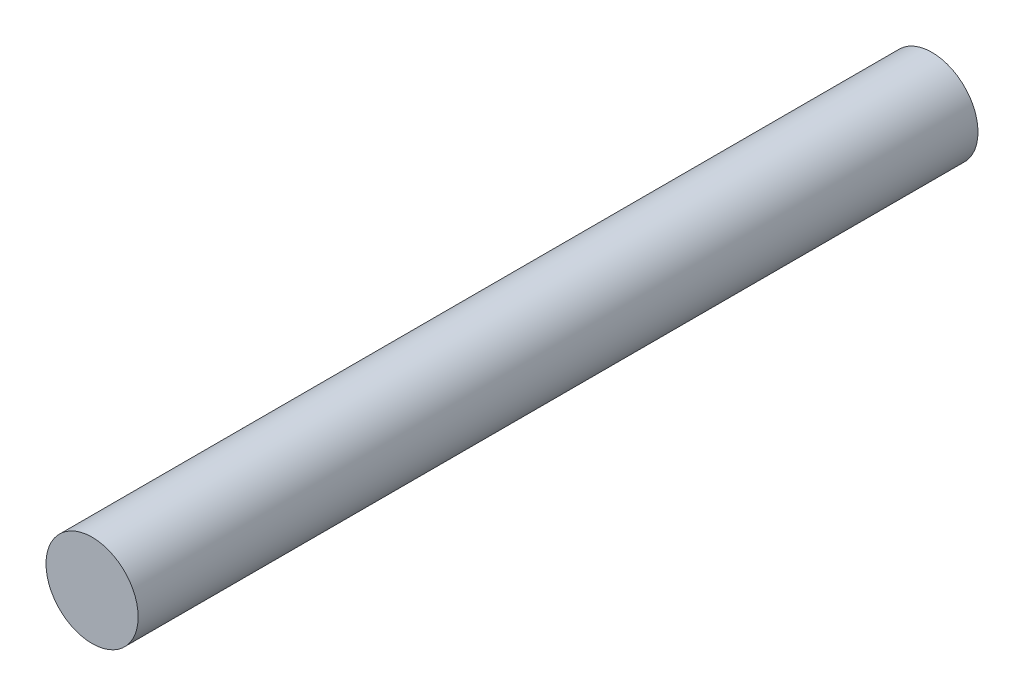
ISO-10303-21;
HEADER;
FILE_DESCRIPTION(('STEP AP214'),'2;1');
FILE_NAME('part.step','',(''),(''),'','','');
FILE_SCHEMA(('AUTOMOTIVE_DESIGN { 1 0 10303 214 1 1 1 1 }'));
ENDSEC;
DATA;
#1=APPLICATION_CONTEXT('core data for automotive mechanical design processes');
#2=APPLICATION_PROTOCOL_DEFINITION('international standard','automotive_design',2000,#1);
#3=PRODUCT_CONTEXT('',#1,'mechanical');
#4=PRODUCT('Part','Part','',(#3));
#5=PRODUCT_RELATED_PRODUCT_CATEGORY('part','',(#4));
#6=PRODUCT_DEFINITION_FORMATION('','',#4);
#7=PRODUCT_DEFINITION_CONTEXT('part definition',#1,'design');
#8=PRODUCT_DEFINITION('design','',#6,#7);
#9=PRODUCT_DEFINITION_SHAPE('','',#8);
#10=(LENGTH_UNIT() NAMED_UNIT(*) SI_UNIT(.MILLI.,.METRE.));
#11=(NAMED_UNIT(*) PLANE_ANGLE_UNIT() SI_UNIT($,.RADIAN.));
#12=(NAMED_UNIT(*) SI_UNIT($,.STERADIAN.) SOLID_ANGLE_UNIT());
#13=UNCERTAINTY_MEASURE_WITH_UNIT(LENGTH_MEASURE(1.E-05),#10,'distance_accuracy_value','');
#14=(GEOMETRIC_REPRESENTATION_CONTEXT(3) GLOBAL_UNCERTAINTY_ASSIGNED_CONTEXT((#13)) GLOBAL_UNIT_ASSIGNED_CONTEXT((#10,
#11,#12)) REPRESENTATION_CONTEXT('',''));
#15=CARTESIAN_POINT('',(0.,0.,0.));
#16=DIRECTION('',(0.,0.,1.));
#17=DIRECTION('',(1.,0.,0.));
#18=AXIS2_PLACEMENT_3D('',#15,#16,#17);
#19=CARTESIAN_POINT('',(0.,0.,14.5773797371133));
#20=DIRECTION('',(0.,0.,1.));
#21=DIRECTION('',(1.,0.,0.));
#22=AXIS2_PLACEMENT_3D('',#19,#20,#21);
#23=PLANE('',#22);
#24=CARTESIAN_POINT('',(0.,0.,14.5773797371133));
#25=DIRECTION('',(0.,0.,-1.));
#26=DIRECTION('',(-1.,0.,0.));
#27=AXIS2_PLACEMENT_3D('',#24,#25,#26);
#28=CIRCLE('',#27,1.6);
#29=CARTESIAN_POINT('',(-1.6,0.,14.5773797371133));
#30=VERTEX_POINT('',#29);
#31=EDGE_CURVE('E9',#30,#30,#28,.T.);
#32=ORIENTED_EDGE('',*,*,#31,.F.);
#33=EDGE_LOOP('',(#32));
#34=FACE_BOUND('',#33,.T.);
#35=ADVANCED_FACE('F14',(#34),#23,.T.);
#36=CARTESIAN_POINT('',(0.,0.,-14.5773797371133));
#37=DIRECTION('',(0.,0.,-1.));
#38=DIRECTION('',(-1.,0.,0.));
#39=AXIS2_PLACEMENT_3D('',#36,#37,#38);
#40=PLANE('',#39);
#41=CARTESIAN_POINT('',(0.,0.,-14.5773797371133));
#42=DIRECTION('',(0.,0.,1.));
#43=DIRECTION('',(1.,0.,0.));
#44=AXIS2_PLACEMENT_3D('',#41,#42,#43);
#45=CIRCLE('',#44,1.6);
#46=CARTESIAN_POINT('',(1.6,0.,-14.5773797371133));
#47=VERTEX_POINT('',#46);
#48=EDGE_CURVE('E21',#47,#47,#45,.T.);
#49=ORIENTED_EDGE('',*,*,#48,.F.);
#50=EDGE_LOOP('',(#49));
#51=FACE_BOUND('',#50,.T.);
#52=ADVANCED_FACE('F29',(#51),#40,.T.);
#53=CARTESIAN_POINT('',(0.,0.,-14.5773797371133));
#54=DIRECTION('',(0.,0.,1.));
#55=DIRECTION('',(1.,0.,0.));
#56=AXIS2_PLACEMENT_3D('',#53,#54,#55);
#57=CYLINDRICAL_SURFACE('',#56,1.6);
#58=ORIENTED_EDGE('',*,*,#31,.T.);
#59=EDGE_LOOP('',(#58));
#60=FACE_BOUND('',#59,.T.);
#61=ORIENTED_EDGE('',*,*,#48,.T.);
#62=EDGE_LOOP('',(#61));
#63=FACE_BOUND('',#62,.T.);
#64=ADVANCED_FACE('F16',(#60,#63),#57,.T.);
#65=CLOSED_SHELL('',(#35,#52,#64));
#66=MANIFOLD_SOLID_BREP('B1',#65);
#67=ADVANCED_BREP_SHAPE_REPRESENTATION('',(#18,#66),#14);
#68=SHAPE_DEFINITION_REPRESENTATION(#9,#67);
ENDSEC;
END-ISO-10303-21;
